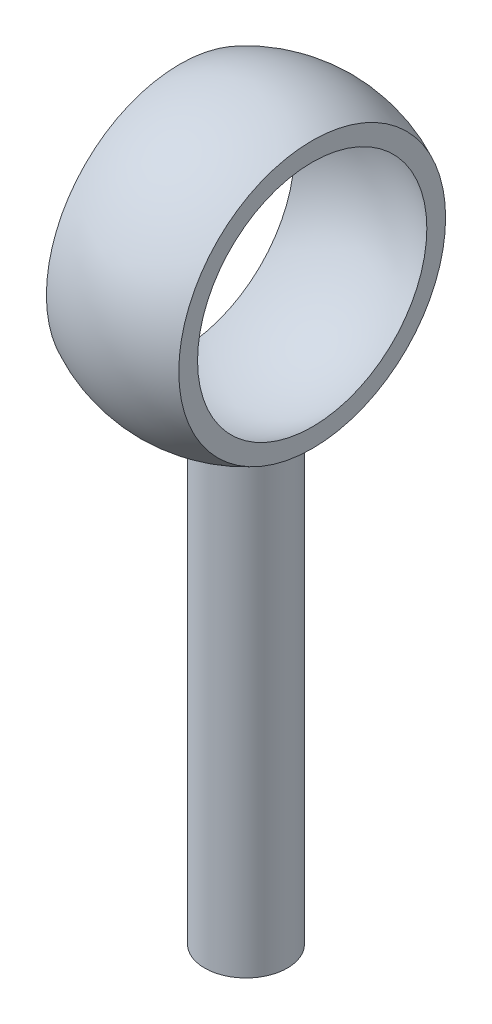
ISO-10303-21;
HEADER;
FILE_DESCRIPTION(('STEP AP214'),'2;1');
FILE_NAME('part.step','',(''),(''),'','','');
FILE_SCHEMA(('AUTOMOTIVE_DESIGN { 1 0 10303 214 1 1 1 1 }'));
ENDSEC;
DATA;
#1=APPLICATION_CONTEXT('core data for automotive mechanical design processes');
#2=APPLICATION_PROTOCOL_DEFINITION('international standard','automotive_design',2000,#1);
#3=PRODUCT_CONTEXT('',#1,'mechanical');
#4=PRODUCT('Part','Part','',(#3));
#5=PRODUCT_RELATED_PRODUCT_CATEGORY('part','',(#4));
#6=PRODUCT_DEFINITION_FORMATION('','',#4);
#7=PRODUCT_DEFINITION_CONTEXT('part definition',#1,'design');
#8=PRODUCT_DEFINITION('design','',#6,#7);
#9=PRODUCT_DEFINITION_SHAPE('','',#8);
#10=(LENGTH_UNIT() NAMED_UNIT(*) SI_UNIT(.MILLI.,.METRE.));
#11=(NAMED_UNIT(*) PLANE_ANGLE_UNIT() SI_UNIT($,.RADIAN.));
#12=(NAMED_UNIT(*) SI_UNIT($,.STERADIAN.) SOLID_ANGLE_UNIT());
#13=UNCERTAINTY_MEASURE_WITH_UNIT(LENGTH_MEASURE(1.E-05),#10,'distance_accuracy_value','');
#14=(GEOMETRIC_REPRESENTATION_CONTEXT(3) GLOBAL_UNCERTAINTY_ASSIGNED_CONTEXT((#13)) GLOBAL_UNIT_ASSIGNED_CONTEXT((#10,
#11,#12)) REPRESENTATION_CONTEXT('',''));
#15=CARTESIAN_POINT('',(0.,0.,0.));
#16=DIRECTION('',(0.,0.,1.));
#17=DIRECTION('',(1.,0.,0.));
#18=AXIS2_PLACEMENT_3D('',#15,#16,#17);
#19=CARTESIAN_POINT('',(0.,-8.,0.));
#20=DIRECTION('',(0.,-1.,0.));
#21=DIRECTION('',(0.,0.,-1.));
#22=AXIS2_PLACEMENT_3D('',#19,#20,#21);
#23=CYLINDRICAL_SURFACE('',#22,2.5);
#24=CARTESIAN_POINT('',(0.,-8.,0.));
#25=DIRECTION('',(0.,1.,0.));
#26=DIRECTION('',(0.,0.,1.));
#27=AXIS2_PLACEMENT_3D('',#24,#25,#26);
#28=CIRCLE('',#27,2.5);
#29=CARTESIAN_POINT('',(0.,-8.,2.5));
#30=VERTEX_POINT('',#29);
#31=EDGE_CURVE('E12',#30,#30,#28,.T.);
#32=ORIENTED_EDGE('',*,*,#31,.F.);
#33=EDGE_LOOP('',(#32));
#34=FACE_BOUND('',#33,.T.);
#35=CARTESIAN_POINT('',(0.,-36.,0.));
#36=DIRECTION('',(0.,1.,0.));
#37=DIRECTION('',(0.,0.,1.));
#38=AXIS2_PLACEMENT_3D('',#35,#36,#37);
#39=CIRCLE('',#38,2.5);
#40=CARTESIAN_POINT('',(0.,-36.,2.5));
#41=VERTEX_POINT('',#40);
#42=EDGE_CURVE('E53',#41,#41,#39,.T.);
#43=ORIENTED_EDGE('',*,*,#42,.T.);
#44=EDGE_LOOP('',(#43));
#45=FACE_BOUND('',#44,.T.);
#46=ADVANCED_FACE('F46',(#34,#45),#23,.T.);
#47=CARTESIAN_POINT('',(0.,-8.,0.));
#48=DIRECTION('',(0.,1.,0.));
#49=DIRECTION('',(0.,0.,1.));
#50=AXIS2_PLACEMENT_3D('',#47,#48,#49);
#51=PLANE('',#50);
#52=ORIENTED_EDGE('',*,*,#31,.T.);
#53=EDGE_LOOP('',(#52));
#54=FACE_BOUND('',#53,.T.);
#55=ADVANCED_FACE('F63',(#54),#51,.T.);
#56=CARTESIAN_POINT('',(0.,-36.,0.));
#57=DIRECTION('',(0.,1.,0.));
#58=DIRECTION('',(0.,0.,1.));
#59=AXIS2_PLACEMENT_3D('',#56,#57,#58);
#60=PLANE('',#59);
#61=ORIENTED_EDGE('',*,*,#42,.F.);
#62=EDGE_LOOP('',(#61));
#63=FACE_BOUND('',#62,.T.);
#64=ADVANCED_FACE('F61',(#63),#60,.F.);
#65=CLOSED_SHELL('',(#46,#55,#64));
#66=MANIFOLD_SOLID_BREP('B2',#65);
#67=CARTESIAN_POINT('',(0.,0.,0.));
#68=DIRECTION('',(0.,1.,0.));
#69=DIRECTION('',(0.,0.,-1.));
#70=AXIS2_PLACEMENT_3D('',#67,#68,#69);
#71=SPHERICAL_SURFACE('',#70,9.);
#72=CARTESIAN_POINT('',(0.,0.,0.));
#73=DIRECTION('',(-1.,0.,0.));
#74=DIRECTION('',(0.,0.,1.));
#75=AXIS2_PLACEMENT_3D('',#72,#73,#74);
#76=SPHERICAL_SURFACE('',#75,9.);
#77=CARTESIAN_POINT('',(-4.,0.,0.));
#78=DIRECTION('',(-1.,0.,0.));
#79=DIRECTION('',(0.,0.,1.));
#80=AXIS2_PLACEMENT_3D('',#77,#78,#79);
#81=CIRCLE('',#80,8.06225774829855);
#82=CARTESIAN_POINT('',(-4.,0.,8.06225774829855));
#83=VERTEX_POINT('',#82);
#84=EDGE_CURVE('E96',#83,#83,#81,.F.);
#85=ORIENTED_EDGE('',*,*,#84,.T.);
#86=EDGE_LOOP('',(#85));
#87=FACE_BOUND('',#86,.T.);
#88=CARTESIAN_POINT('',(4.,0.,0.));
#89=DIRECTION('',(1.,0.,0.));
#90=DIRECTION('',(0.,0.,-1.));
#91=AXIS2_PLACEMENT_3D('',#88,#89,#90);
#92=CIRCLE('',#91,8.06225774829855);
#93=CARTESIAN_POINT('',(4.,0.,-8.06225774829855));
#94=VERTEX_POINT('',#93);
#95=EDGE_CURVE('E45',#94,#94,#92,.F.);
#96=ORIENTED_EDGE('',*,*,#95,.T.);
#97=EDGE_LOOP('',(#96));
#98=FACE_BOUND('',#97,.T.);
#99=ADVANCED_FACE('F89',(#87,#98),#76,.T.);
#100=CARTESIAN_POINT('',(-4.,-29.4774502017861,-9.));
#101=DIRECTION('',(-1.,0.,0.));
#102=DIRECTION('',(0.,0.,1.));
#103=AXIS2_PLACEMENT_3D('',#100,#101,#102);
#104=PLANE('',#103);
#105=CARTESIAN_POINT('',(-4.,0.,0.));
#106=DIRECTION('',(-1.,0.,0.));
#107=DIRECTION('',(0.,0.,1.));
#108=AXIS2_PLACEMENT_3D('',#105,#106,#107);
#109=CIRCLE('',#108,6.92820323027551);
#110=CARTESIAN_POINT('',(-4.,0.,6.92820323027551));
#111=VERTEX_POINT('',#110);
#112=EDGE_CURVE('E100',#111,#111,#109,.F.);
#113=ORIENTED_EDGE('',*,*,#112,.T.);
#114=EDGE_LOOP('',(#113));
#115=FACE_BOUND('',#114,.T.);
#116=ORIENTED_EDGE('',*,*,#84,.F.);
#117=EDGE_LOOP('',(#116));
#118=FACE_BOUND('',#117,.T.);
#119=ADVANCED_FACE('F119',(#115,#118),#104,.T.);
#120=CARTESIAN_POINT('',(4.,-29.4774502017861,-9.));
#121=DIRECTION('',(1.,0.,0.));
#122=DIRECTION('',(0.,0.,-1.));
#123=AXIS2_PLACEMENT_3D('',#120,#121,#122);
#124=PLANE('',#123);
#125=CARTESIAN_POINT('',(4.,0.,0.));
#126=DIRECTION('',(1.,0.,0.));
#127=DIRECTION('',(0.,0.,-1.));
#128=AXIS2_PLACEMENT_3D('',#125,#126,#127);
#129=CIRCLE('',#128,6.92820323027551);
#130=CARTESIAN_POINT('',(4.,0.,-6.92820323027551));
#131=VERTEX_POINT('',#130);
#132=EDGE_CURVE('E92',#131,#131,#129,.F.);
#133=ORIENTED_EDGE('',*,*,#132,.T.);
#134=EDGE_LOOP('',(#133));
#135=FACE_BOUND('',#134,.T.);
#136=ORIENTED_EDGE('',*,*,#95,.F.);
#137=EDGE_LOOP('',(#136));
#138=FACE_BOUND('',#137,.T.);
#139=ADVANCED_FACE('F109',(#135,#138),#124,.T.);
#140=CARTESIAN_POINT('',(0.,0.,0.));
#141=DIRECTION('',(0.,0.,-1.));
#142=DIRECTION('',(1.,0.,0.));
#143=AXIS2_PLACEMENT_3D('',#140,#141,#142);
#144=SPHERICAL_SURFACE('',#143,8.);
#145=CARTESIAN_POINT('',(0.,0.,0.));
#146=DIRECTION('',(-1.,0.,0.));
#147=DIRECTION('',(0.,0.,1.));
#148=AXIS2_PLACEMENT_3D('',#145,#146,#147);
#149=SPHERICAL_SURFACE('',#148,8.);
#150=ORIENTED_EDGE('',*,*,#112,.F.);
#151=EDGE_LOOP('',(#150));
#152=FACE_BOUND('',#151,.T.);
#153=ORIENTED_EDGE('',*,*,#132,.F.);
#154=EDGE_LOOP('',(#153));
#155=FACE_BOUND('',#154,.T.);
#156=ADVANCED_FACE('F112',(#152,#155),#149,.F.);
#157=CLOSED_SHELL('',(#99,#119,#139,#156));
#158=MANIFOLD_SOLID_BREP('B7',#157);
#159=ADVANCED_BREP_SHAPE_REPRESENTATION('',(#18,#66,#158),#14);
#160=SHAPE_DEFINITION_REPRESENTATION(#9,#159);
ENDSEC;
END-ISO-10303-21;
